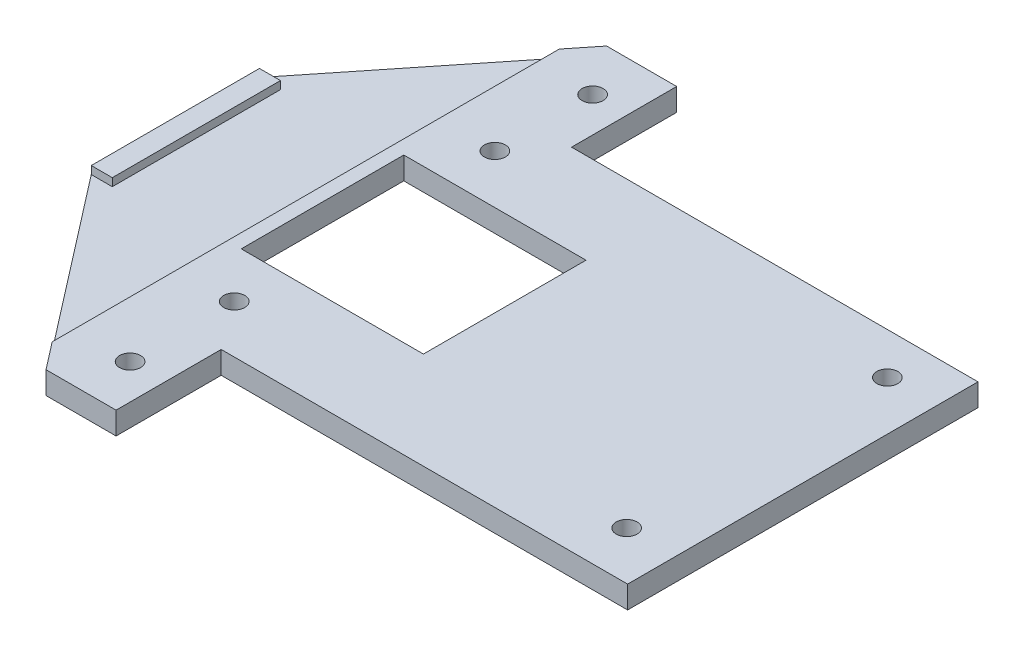
ISO-10303-21;
HEADER;
FILE_DESCRIPTION(('STEP AP214'),'2;1');
FILE_NAME('part.step','',(''),(''),'','','');
FILE_SCHEMA(('AUTOMOTIVE_DESIGN { 1 0 10303 214 1 1 1 1 }'));
ENDSEC;
DATA;
#1=APPLICATION_CONTEXT('core data for automotive mechanical design processes');
#2=APPLICATION_PROTOCOL_DEFINITION('international standard','automotive_design',2000,#1);
#3=PRODUCT_CONTEXT('',#1,'mechanical');
#4=PRODUCT('Part','Part','',(#3));
#5=PRODUCT_RELATED_PRODUCT_CATEGORY('part','',(#4));
#6=PRODUCT_DEFINITION_FORMATION('','',#4);
#7=PRODUCT_DEFINITION_CONTEXT('part definition',#1,'design');
#8=PRODUCT_DEFINITION('design','',#6,#7);
#9=PRODUCT_DEFINITION_SHAPE('','',#8);
#10=(LENGTH_UNIT() NAMED_UNIT(*) SI_UNIT(.MILLI.,.METRE.));
#11=(NAMED_UNIT(*) PLANE_ANGLE_UNIT() SI_UNIT($,.RADIAN.));
#12=(NAMED_UNIT(*) SI_UNIT($,.STERADIAN.) SOLID_ANGLE_UNIT());
#13=UNCERTAINTY_MEASURE_WITH_UNIT(LENGTH_MEASURE(1.E-05),#10,'distance_accuracy_value','');
#14=(GEOMETRIC_REPRESENTATION_CONTEXT(3) GLOBAL_UNCERTAINTY_ASSIGNED_CONTEXT((#13)) GLOBAL_UNIT_ASSIGNED_CONTEXT((#10,
#11,#12)) REPRESENTATION_CONTEXT('',''));
#15=CARTESIAN_POINT('',(0.,0.,0.));
#16=DIRECTION('',(0.,0.,1.));
#17=DIRECTION('',(1.,0.,0.));
#18=AXIS2_PLACEMENT_3D('',#15,#16,#17);
#19=CARTESIAN_POINT('',(0.,1.6,0.));
#20=DIRECTION('',(0.,1.,0.));
#21=DIRECTION('',(0.,0.,1.));
#22=AXIS2_PLACEMENT_3D('',#19,#20,#21);
#23=PLANE('',#22);
#24=CARTESIAN_POINT('',(13.5,1.6,-9.3));
#25=DIRECTION('',(0.,1.,0.));
#26=DIRECTION('',(0.,0.,1.));
#27=AXIS2_PLACEMENT_3D('',#24,#25,#26);
#28=CIRCLE('',#27,0.75);
#29=CARTESIAN_POINT('',(13.5,1.6,-8.55));
#30=VERTEX_POINT('',#29);
#31=EDGE_CURVE('E316',#30,#30,#28,.T.);
#32=ORIENTED_EDGE('',*,*,#31,.F.);
#33=EDGE_LOOP('',(#32));
#34=FACE_BOUND('',#33,.T.);
#35=CARTESIAN_POINT('',(41.5,1.6,-9.3));
#36=DIRECTION('',(0.,1.,0.));
#37=DIRECTION('',(0.,0.,1.));
#38=AXIS2_PLACEMENT_3D('',#35,#36,#37);
#39=CIRCLE('',#38,0.749999999999999);
#40=CARTESIAN_POINT('',(41.5,1.6,-8.55));
#41=VERTEX_POINT('',#40);
#42=EDGE_CURVE('E342',#41,#41,#39,.T.);
#43=ORIENTED_EDGE('',*,*,#42,.F.);
#44=EDGE_LOOP('',(#43));
#45=FACE_BOUND('',#44,.T.);
#46=CARTESIAN_POINT('',(41.5,1.6,9.3));
#47=DIRECTION('',(0.,1.,0.));
#48=DIRECTION('',(0.,0.,1.));
#49=AXIS2_PLACEMENT_3D('',#46,#47,#48);
#50=CIRCLE('',#49,0.749999999999999);
#51=CARTESIAN_POINT('',(41.5,1.6,10.05));
#52=VERTEX_POINT('',#51);
#53=EDGE_CURVE('E339',#52,#52,#50,.T.);
#54=ORIENTED_EDGE('',*,*,#53,.F.);
#55=EDGE_LOOP('',(#54));
#56=FACE_BOUND('',#55,.T.);
#57=CARTESIAN_POINT('',(13.5,1.6,9.3));
#58=DIRECTION('',(0.,1.,0.));
#59=DIRECTION('',(0.,0.,1.));
#60=AXIS2_PLACEMENT_3D('',#57,#58,#59);
#61=CIRCLE('',#60,0.75);
#62=CARTESIAN_POINT('',(13.5,1.6,10.05));
#63=VERTEX_POINT('',#62);
#64=EDGE_CURVE('E336',#63,#63,#61,.T.);
#65=ORIENTED_EDGE('',*,*,#64,.F.);
#66=EDGE_LOOP('',(#65));
#67=FACE_BOUND('',#66,.T.);
#68=CARTESIAN_POINT('',(13.5,1.6,16.73));
#69=DIRECTION('',(0.,1.,0.));
#70=DIRECTION('',(0.,0.,1.));
#71=AXIS2_PLACEMENT_3D('',#68,#69,#70);
#72=CIRCLE('',#71,0.75);
#73=CARTESIAN_POINT('',(13.5,1.6,17.48));
#74=VERTEX_POINT('',#73);
#75=EDGE_CURVE('E333',#74,#74,#72,.T.);
#76=ORIENTED_EDGE('',*,*,#75,.F.);
#77=EDGE_LOOP('',(#76));
#78=FACE_BOUND('',#77,.T.);
#79=CARTESIAN_POINT('',(13.5,1.6,-16.27));
#80=DIRECTION('',(0.,1.,0.));
#81=DIRECTION('',(0.,0.,1.));
#82=AXIS2_PLACEMENT_3D('',#79,#80,#81);
#83=CIRCLE('',#82,0.75);
#84=CARTESIAN_POINT('',(13.5,1.6,-15.52));
#85=VERTEX_POINT('',#84);
#86=EDGE_CURVE('E311',#85,#85,#83,.T.);
#87=ORIENTED_EDGE('',*,*,#86,.F.);
#88=EDGE_LOOP('',(#87));
#89=FACE_BOUND('',#88,.T.);
#90=DIRECTION('',(0.,0.,1.));
#91=VECTOR('',#90,1.);
#92=CARTESIAN_POINT('',(10.5,1.6,-5.8));
#93=LINE('',#92,#91);
#94=CARTESIAN_POINT('',(10.5,1.6,-5.8));
#95=VERTEX_POINT('',#94);
#96=CARTESIAN_POINT('',(10.5,1.6,5.8));
#97=VERTEX_POINT('',#96);
#98=EDGE_CURVE('E49',#95,#97,#93,.T.);
#99=ORIENTED_EDGE('',*,*,#98,.F.);
#100=DIRECTION('',(-1.,0.,0.));
#101=VECTOR('',#100,1.);
#102=CARTESIAN_POINT('',(10.5,1.6,-5.8));
#103=LINE('',#102,#101);
#104=CARTESIAN_POINT('',(23.5,1.6,-5.8));
#105=VERTEX_POINT('',#104);
#106=EDGE_CURVE('E183',#105,#95,#103,.T.);
#107=ORIENTED_EDGE('',*,*,#106,.F.);
#108=DIRECTION('',(0.,0.,-1.));
#109=VECTOR('',#108,1.);
#110=CARTESIAN_POINT('',(23.5,1.6,-5.8));
#111=LINE('',#110,#109);
#112=CARTESIAN_POINT('',(23.5,1.6,5.8));
#113=VERTEX_POINT('',#112);
#114=EDGE_CURVE('E168',#113,#105,#111,.T.);
#115=ORIENTED_EDGE('',*,*,#114,.F.);
#116=DIRECTION('',(1.,0.,0.));
#117=VECTOR('',#116,1.);
#118=CARTESIAN_POINT('',(10.5,1.6,5.8));
#119=LINE('',#118,#117);
#120=EDGE_CURVE('E177',#97,#113,#119,.T.);
#121=ORIENTED_EDGE('',*,*,#120,.F.);
#122=EDGE_LOOP('',(#99,#107,#115,#121));
#123=FACE_BOUND('',#122,.T.);
#124=DIRECTION('',(0.,0.,-1.));
#125=VECTOR('',#124,1.);
#126=CARTESIAN_POINT('',(9.5,1.6,18.2895454545455));
#127=LINE('',#126,#125);
#128=CARTESIAN_POINT('',(9.5,1.6,18.2895454545455));
#129=VERTEX_POINT('',#128);
#130=CARTESIAN_POINT('',(9.5,1.6,-17.8922727272727));
#131=VERTEX_POINT('',#130);
#132=EDGE_CURVE('E197',#129,#131,#127,.T.);
#133=ORIENTED_EDGE('',*,*,#132,.F.);
#134=DIRECTION('',(0.611589905380932,0.,0.791174941233696));
#135=VECTOR('',#134,1.);
#136=CARTESIAN_POINT('',(0.,1.6,6.));
#137=LINE('',#136,#135);
#138=CARTESIAN_POINT('',(11.,1.6,20.23));
#139=VERTEX_POINT('',#138);
#140=EDGE_CURVE('E236',#129,#139,#137,.T.);
#141=ORIENTED_EDGE('',*,*,#140,.T.);
#142=DIRECTION('',(1.,0.,0.));
#143=VECTOR('',#142,1.);
#144=CARTESIAN_POINT('',(11.,1.6,20.23));
#145=LINE('',#144,#143);
#146=CARTESIAN_POINT('',(16.,1.6,20.23));
#147=VERTEX_POINT('',#146);
#148=EDGE_CURVE('E238',#139,#147,#145,.T.);
#149=ORIENTED_EDGE('',*,*,#148,.T.);
#150=DIRECTION('',(0.,0.,-1.));
#151=VECTOR('',#150,1.);
#152=CARTESIAN_POINT('',(16.,1.6,20.23));
#153=LINE('',#152,#151);
#154=CARTESIAN_POINT('',(16.,1.6,12.73));
#155=VERTEX_POINT('',#154);
#156=EDGE_CURVE('E240',#147,#155,#153,.T.);
#157=ORIENTED_EDGE('',*,*,#156,.T.);
#158=DIRECTION('',(1.,0.,0.));
#159=VECTOR('',#158,1.);
#160=CARTESIAN_POINT('',(16.,1.6,12.73));
#161=LINE('',#160,#159);
#162=CARTESIAN_POINT('',(45.,1.6,12.73));
#163=VERTEX_POINT('',#162);
#164=EDGE_CURVE('E242',#155,#163,#161,.T.);
#165=ORIENTED_EDGE('',*,*,#164,.T.);
#166=DIRECTION('',(0.,0.,-1.));
#167=VECTOR('',#166,1.);
#168=CARTESIAN_POINT('',(45.,1.6,12.73));
#169=LINE('',#168,#167);
#170=CARTESIAN_POINT('',(45.,1.6,-12.27));
#171=VERTEX_POINT('',#170);
#172=EDGE_CURVE('E244',#163,#171,#169,.T.);
#173=ORIENTED_EDGE('',*,*,#172,.T.);
#174=DIRECTION('',(-1.,0.,0.));
#175=VECTOR('',#174,1.);
#176=CARTESIAN_POINT('',(45.,1.6,-12.27));
#177=LINE('',#176,#175);
#178=CARTESIAN_POINT('',(16.,1.6,-12.27));
#179=VERTEX_POINT('',#178);
#180=EDGE_CURVE('E246',#171,#179,#177,.T.);
#181=ORIENTED_EDGE('',*,*,#180,.T.);
#182=DIRECTION('',(0.,0.,-1.));
#183=VECTOR('',#182,1.);
#184=CARTESIAN_POINT('',(16.,1.6,-12.27));
#185=LINE('',#184,#183);
#186=CARTESIAN_POINT('',(16.,1.6,-19.77));
#187=VERTEX_POINT('',#186);
#188=EDGE_CURVE('E248',#179,#187,#185,.T.);
#189=ORIENTED_EDGE('',*,*,#188,.T.);
#190=DIRECTION('',(-1.,0.,0.));
#191=VECTOR('',#190,1.);
#192=CARTESIAN_POINT('',(16.,1.6,-19.77));
#193=LINE('',#192,#191);
#194=CARTESIAN_POINT('',(11.,1.6,-19.77));
#195=VERTEX_POINT('',#194);
#196=EDGE_CURVE('E250',#187,#195,#193,.T.);
#197=ORIENTED_EDGE('',*,*,#196,.T.);
#198=DIRECTION('',(-0.624141328431295,0.,0.781311462954448));
#199=VECTOR('',#198,1.);
#200=CARTESIAN_POINT('',(11.,1.6,-19.77));
#201=LINE('',#200,#199);
#202=EDGE_CURVE('E229',#195,#131,#201,.T.);
#203=ORIENTED_EDGE('',*,*,#202,.T.);
#204=EDGE_LOOP('',(#133,#141,#149,#157,#165,#173,#181,#189,#197,#203));
#205=FACE_BOUND('',#204,.T.);
#206=ADVANCED_FACE('F32',(#34,#45,#56,#67,#78,#89,#123,#205),#23,.T.);
#207=CARTESIAN_POINT('',(11.,1.6,-19.77));
#208=DIRECTION('',(0.781311462954448,0.,0.624141328431295));
#209=DIRECTION('',(0.624141328431295,0.,-0.781311462954448));
#210=AXIS2_PLACEMENT_3D('',#207,#208,#209);
#211=PLANE('',#210);
#212=DIRECTION('',(-0.624141328431294,0.,0.781311462954448));
#213=VECTOR('',#212,1.);
#214=CARTESIAN_POINT('',(9.5,1.04,-17.8922727272727));
#215=LINE('',#214,#213);
#216=CARTESIAN_POINT('',(9.5,1.04,-17.8922727272727));
#217=VERTEX_POINT('',#216);
#218=CARTESIAN_POINT('',(0.,1.04,-6.));
#219=VERTEX_POINT('',#218);
#220=EDGE_CURVE('E193',#217,#219,#215,.T.);
#221=ORIENTED_EDGE('',*,*,#220,.F.);
#222=DIRECTION('',(0.,1.,0.));
#223=VECTOR('',#222,1.);
#224=CARTESIAN_POINT('',(9.5,1.04,-17.8922727272727));
#225=LINE('',#224,#223);
#226=EDGE_CURVE('E220',#217,#131,#225,.T.);
#227=ORIENTED_EDGE('',*,*,#226,.T.);
#228=ORIENTED_EDGE('',*,*,#202,.F.);
#229=DIRECTION('',(0.,-1.,0.));
#230=VECTOR('',#229,1.);
#231=CARTESIAN_POINT('',(11.,1.6,-19.77));
#232=LINE('',#231,#230);
#233=CARTESIAN_POINT('',(11.,0.,-19.77));
#234=VERTEX_POINT('',#233);
#235=EDGE_CURVE('E252',#195,#234,#232,.T.);
#236=ORIENTED_EDGE('',*,*,#235,.T.);
#237=DIRECTION('',(-0.624141328431295,0.,0.781311462954448));
#238=VECTOR('',#237,1.);
#239=CARTESIAN_POINT('',(11.,0.,-19.77));
#240=LINE('',#239,#238);
#241=CARTESIAN_POINT('',(0.,0.,-6.));
#242=VERTEX_POINT('',#241);
#243=EDGE_CURVE('E223',#234,#242,#240,.T.);
#244=ORIENTED_EDGE('',*,*,#243,.T.);
#245=DIRECTION('',(0.,-1.,0.));
#246=VECTOR('',#245,1.);
#247=CARTESIAN_POINT('',(0.,1.6,-6.));
#248=LINE('',#247,#246);
#249=EDGE_CURVE('E299',#219,#242,#248,.T.);
#250=ORIENTED_EDGE('',*,*,#249,.F.);
#251=EDGE_LOOP('',(#221,#227,#228,#236,#244,#250));
#252=FACE_BOUND('',#251,.T.);
#253=ADVANCED_FACE('F34',(#252),#211,.F.);
#254=CARTESIAN_POINT('',(0.,1.6,-6.));
#255=DIRECTION('',(1.,0.,0.));
#256=DIRECTION('',(0.,0.,-1.));
#257=AXIS2_PLACEMENT_3D('',#254,#255,#256);
#258=PLANE('',#257);
#259=DIRECTION('',(0.,0.,1.));
#260=VECTOR('',#259,1.);
#261=CARTESIAN_POINT('',(0.,0.,-6.));
#262=LINE('',#261,#260);
#263=CARTESIAN_POINT('',(0.,0.,6.));
#264=VERTEX_POINT('',#263);
#265=EDGE_CURVE('E255',#242,#264,#262,.T.);
#266=ORIENTED_EDGE('',*,*,#265,.T.);
#267=DIRECTION('',(0.,-1.,0.));
#268=VECTOR('',#267,1.);
#269=CARTESIAN_POINT('',(0.,1.6,6.));
#270=LINE('',#269,#268);
#271=CARTESIAN_POINT('',(0.,1.04,6.));
#272=VERTEX_POINT('',#271);
#273=EDGE_CURVE('E296',#272,#264,#270,.T.);
#274=ORIENTED_EDGE('',*,*,#273,.F.);
#275=CARTESIAN_POINT('',(0.,1.6,6.));
#276=VERTEX_POINT('',#275);
#277=EDGE_CURVE('E297',#276,#272,#270,.T.);
#278=ORIENTED_EDGE('',*,*,#277,.F.);
#279=DIRECTION('',(0.,0.,1.));
#280=VECTOR('',#279,1.);
#281=CARTESIAN_POINT('',(0.,1.6,-6.));
#282=LINE('',#281,#280);
#283=CARTESIAN_POINT('',(0.,1.6,-6.));
#284=VERTEX_POINT('',#283);
#285=EDGE_CURVE('E232',#284,#276,#282,.T.);
#286=ORIENTED_EDGE('',*,*,#285,.F.);
#287=EDGE_CURVE('E300',#284,#219,#248,.T.);
#288=ORIENTED_EDGE('',*,*,#287,.T.);
#289=ORIENTED_EDGE('',*,*,#249,.T.);
#290=EDGE_LOOP('',(#266,#274,#278,#286,#288,#289));
#291=FACE_BOUND('',#290,.T.);
#292=ADVANCED_FACE('F431',(#291),#258,.F.);
#293=CARTESIAN_POINT('',(0.,1.6,6.));
#294=DIRECTION('',(0.791174941233696,0.,-0.611589905380932));
#295=DIRECTION('',(-0.611589905380932,0.,-0.791174941233696));
#296=AXIS2_PLACEMENT_3D('',#293,#294,#295);
#297=PLANE('',#296);
#298=ORIENTED_EDGE('',*,*,#140,.F.);
#299=DIRECTION('',(0.,1.,0.));
#300=VECTOR('',#299,1.);
#301=CARTESIAN_POINT('',(9.5,1.04,18.2895454545455));
#302=LINE('',#301,#300);
#303=CARTESIAN_POINT('',(9.5,1.04,18.2895454545455));
#304=VERTEX_POINT('',#303);
#305=EDGE_CURVE('E224',#304,#129,#302,.T.);
#306=ORIENTED_EDGE('',*,*,#305,.F.);
#307=DIRECTION('',(0.611589905380932,0.,0.791174941233696));
#308=VECTOR('',#307,1.);
#309=CARTESIAN_POINT('',(0.,1.04,6.));
#310=LINE('',#309,#308);
#311=EDGE_CURVE('E206',#272,#304,#310,.T.);
#312=ORIENTED_EDGE('',*,*,#311,.F.);
#313=ORIENTED_EDGE('',*,*,#273,.T.);
#314=DIRECTION('',(0.611589905380932,0.,0.791174941233696));
#315=VECTOR('',#314,1.);
#316=CARTESIAN_POINT('',(0.,0.,6.));
#317=LINE('',#316,#315);
#318=CARTESIAN_POINT('',(11.,0.,20.23));
#319=VERTEX_POINT('',#318);
#320=EDGE_CURVE('E258',#264,#319,#317,.T.);
#321=ORIENTED_EDGE('',*,*,#320,.T.);
#322=DIRECTION('',(0.,-1.,0.));
#323=VECTOR('',#322,1.);
#324=CARTESIAN_POINT('',(11.,1.6,20.23));
#325=LINE('',#324,#323);
#326=EDGE_CURVE('E293',#139,#319,#325,.T.);
#327=ORIENTED_EDGE('',*,*,#326,.F.);
#328=EDGE_LOOP('',(#298,#306,#312,#313,#321,#327));
#329=FACE_BOUND('',#328,.T.);
#330=ADVANCED_FACE('F425',(#329),#297,.F.);
#331=CARTESIAN_POINT('',(11.,1.6,20.23));
#332=DIRECTION('',(0.,0.,-1.));
#333=DIRECTION('',(-1.,0.,0.));
#334=AXIS2_PLACEMENT_3D('',#331,#332,#333);
#335=PLANE('',#334);
#336=DIRECTION('',(1.,0.,0.));
#337=VECTOR('',#336,1.);
#338=CARTESIAN_POINT('',(11.,0.,20.23));
#339=LINE('',#338,#337);
#340=CARTESIAN_POINT('',(16.,0.,20.23));
#341=VERTEX_POINT('',#340);
#342=EDGE_CURVE('E260',#319,#341,#339,.T.);
#343=ORIENTED_EDGE('',*,*,#342,.T.);
#344=DIRECTION('',(0.,-1.,0.));
#345=VECTOR('',#344,1.);
#346=CARTESIAN_POINT('',(16.,1.6,20.23));
#347=LINE('',#346,#345);
#348=EDGE_CURVE('E290',#147,#341,#347,.T.);
#349=ORIENTED_EDGE('',*,*,#348,.F.);
#350=ORIENTED_EDGE('',*,*,#148,.F.);
#351=ORIENTED_EDGE('',*,*,#326,.T.);
#352=EDGE_LOOP('',(#343,#349,#350,#351));
#353=FACE_BOUND('',#352,.T.);
#354=ADVANCED_FACE('F421',(#353),#335,.F.);
#355=CARTESIAN_POINT('',(16.,1.6,20.23));
#356=DIRECTION('',(-1.,0.,0.));
#357=DIRECTION('',(0.,0.,1.));
#358=AXIS2_PLACEMENT_3D('',#355,#356,#357);
#359=PLANE('',#358);
#360=DIRECTION('',(0.,0.,-1.));
#361=VECTOR('',#360,1.);
#362=CARTESIAN_POINT('',(16.,0.,20.23));
#363=LINE('',#362,#361);
#364=CARTESIAN_POINT('',(16.,0.,12.73));
#365=VERTEX_POINT('',#364);
#366=EDGE_CURVE('E262',#341,#365,#363,.T.);
#367=ORIENTED_EDGE('',*,*,#366,.T.);
#368=DIRECTION('',(0.,-1.,0.));
#369=VECTOR('',#368,1.);
#370=CARTESIAN_POINT('',(16.,1.6,12.73));
#371=LINE('',#370,#369);
#372=EDGE_CURVE('E287',#155,#365,#371,.T.);
#373=ORIENTED_EDGE('',*,*,#372,.F.);
#374=ORIENTED_EDGE('',*,*,#156,.F.);
#375=ORIENTED_EDGE('',*,*,#348,.T.);
#376=EDGE_LOOP('',(#367,#373,#374,#375));
#377=FACE_BOUND('',#376,.T.);
#378=ADVANCED_FACE('F416',(#377),#359,.F.);
#379=CARTESIAN_POINT('',(16.,1.6,12.73));
#380=DIRECTION('',(0.,0.,-1.));
#381=DIRECTION('',(-1.,0.,0.));
#382=AXIS2_PLACEMENT_3D('',#379,#380,#381);
#383=PLANE('',#382);
#384=DIRECTION('',(1.,0.,0.));
#385=VECTOR('',#384,1.);
#386=CARTESIAN_POINT('',(16.,0.,12.73));
#387=LINE('',#386,#385);
#388=CARTESIAN_POINT('',(45.,0.,12.73));
#389=VERTEX_POINT('',#388);
#390=EDGE_CURVE('E264',#365,#389,#387,.T.);
#391=ORIENTED_EDGE('',*,*,#390,.T.);
#392=DIRECTION('',(0.,-1.,0.));
#393=VECTOR('',#392,1.);
#394=CARTESIAN_POINT('',(45.,1.6,12.73));
#395=LINE('',#394,#393);
#396=EDGE_CURVE('E284',#163,#389,#395,.T.);
#397=ORIENTED_EDGE('',*,*,#396,.F.);
#398=ORIENTED_EDGE('',*,*,#164,.F.);
#399=ORIENTED_EDGE('',*,*,#372,.T.);
#400=EDGE_LOOP('',(#391,#397,#398,#399));
#401=FACE_BOUND('',#400,.T.);
#402=ADVANCED_FACE('F411',(#401),#383,.F.);
#403=CARTESIAN_POINT('',(45.,1.6,12.73));
#404=DIRECTION('',(-1.,0.,0.));
#405=DIRECTION('',(0.,0.,1.));
#406=AXIS2_PLACEMENT_3D('',#403,#404,#405);
#407=PLANE('',#406);
#408=DIRECTION('',(0.,0.,-1.));
#409=VECTOR('',#408,1.);
#410=CARTESIAN_POINT('',(45.,0.,12.73));
#411=LINE('',#410,#409);
#412=CARTESIAN_POINT('',(45.,0.,-12.27));
#413=VERTEX_POINT('',#412);
#414=EDGE_CURVE('E266',#389,#413,#411,.T.);
#415=ORIENTED_EDGE('',*,*,#414,.T.);
#416=DIRECTION('',(0.,-1.,0.));
#417=VECTOR('',#416,1.);
#418=CARTESIAN_POINT('',(45.,1.6,-12.27));
#419=LINE('',#418,#417);
#420=EDGE_CURVE('E281',#171,#413,#419,.T.);
#421=ORIENTED_EDGE('',*,*,#420,.F.);
#422=ORIENTED_EDGE('',*,*,#172,.F.);
#423=ORIENTED_EDGE('',*,*,#396,.T.);
#424=EDGE_LOOP('',(#415,#421,#422,#423));
#425=FACE_BOUND('',#424,.T.);
#426=ADVANCED_FACE('F407',(#425),#407,.F.);
#427=CARTESIAN_POINT('',(45.,1.6,-12.27));
#428=DIRECTION('',(0.,0.,1.));
#429=DIRECTION('',(1.,0.,0.));
#430=AXIS2_PLACEMENT_3D('',#427,#428,#429);
#431=PLANE('',#430);
#432=DIRECTION('',(-1.,0.,0.));
#433=VECTOR('',#432,1.);
#434=CARTESIAN_POINT('',(45.,0.,-12.27));
#435=LINE('',#434,#433);
#436=CARTESIAN_POINT('',(16.,0.,-12.27));
#437=VERTEX_POINT('',#436);
#438=EDGE_CURVE('E268',#413,#437,#435,.T.);
#439=ORIENTED_EDGE('',*,*,#438,.T.);
#440=DIRECTION('',(0.,-1.,0.));
#441=VECTOR('',#440,1.);
#442=CARTESIAN_POINT('',(16.,1.6,-12.27));
#443=LINE('',#442,#441);
#444=EDGE_CURVE('E278',#179,#437,#443,.T.);
#445=ORIENTED_EDGE('',*,*,#444,.F.);
#446=ORIENTED_EDGE('',*,*,#180,.F.);
#447=ORIENTED_EDGE('',*,*,#420,.T.);
#448=EDGE_LOOP('',(#439,#445,#446,#447));
#449=FACE_BOUND('',#448,.T.);
#450=ADVANCED_FACE('F402',(#449),#431,.F.);
#451=CARTESIAN_POINT('',(16.,1.6,-12.27));
#452=DIRECTION('',(-1.,0.,0.));
#453=DIRECTION('',(0.,0.,1.));
#454=AXIS2_PLACEMENT_3D('',#451,#452,#453);
#455=PLANE('',#454);
#456=DIRECTION('',(0.,0.,-1.));
#457=VECTOR('',#456,1.);
#458=CARTESIAN_POINT('',(16.,0.,-12.27));
#459=LINE('',#458,#457);
#460=CARTESIAN_POINT('',(16.,0.,-19.77));
#461=VERTEX_POINT('',#460);
#462=EDGE_CURVE('E270',#437,#461,#459,.T.);
#463=ORIENTED_EDGE('',*,*,#462,.T.);
#464=DIRECTION('',(0.,-1.,0.));
#465=VECTOR('',#464,1.);
#466=CARTESIAN_POINT('',(16.,1.6,-19.77));
#467=LINE('',#466,#465);
#468=EDGE_CURVE('E275',#187,#461,#467,.T.);
#469=ORIENTED_EDGE('',*,*,#468,.F.);
#470=ORIENTED_EDGE('',*,*,#188,.F.);
#471=ORIENTED_EDGE('',*,*,#444,.T.);
#472=EDGE_LOOP('',(#463,#469,#470,#471));
#473=FACE_BOUND('',#472,.T.);
#474=ADVANCED_FACE('F396',(#473),#455,.F.);
#475=CARTESIAN_POINT('',(16.,1.6,-19.77));
#476=DIRECTION('',(0.,0.,1.));
#477=DIRECTION('',(1.,0.,0.));
#478=AXIS2_PLACEMENT_3D('',#475,#476,#477);
#479=PLANE('',#478);
#480=DIRECTION('',(-1.,0.,0.));
#481=VECTOR('',#480,1.);
#482=CARTESIAN_POINT('',(16.,0.,-19.77));
#483=LINE('',#482,#481);
#484=EDGE_CURVE('E233',#461,#234,#483,.T.);
#485=ORIENTED_EDGE('',*,*,#484,.T.);
#486=ORIENTED_EDGE('',*,*,#235,.F.);
#487=ORIENTED_EDGE('',*,*,#196,.F.);
#488=ORIENTED_EDGE('',*,*,#468,.T.);
#489=EDGE_LOOP('',(#485,#486,#487,#488));
#490=FACE_BOUND('',#489,.T.);
#491=ADVANCED_FACE('F392',(#490),#479,.F.);
#492=DIRECTION('',(-1.,0.,0.));
#493=VECTOR('',#492,1.);
#494=CARTESIAN_POINT('',(0.,1.6,6.));
#495=LINE('',#494,#493);
#496=CARTESIAN_POINT('',(1.5,1.6,6.));
#497=VERTEX_POINT('',#496);
#498=EDGE_CURVE('E217',#497,#276,#495,.T.);
#499=ORIENTED_EDGE('',*,*,#498,.F.);
#500=DIRECTION('',(0.,0.,1.));
#501=VECTOR('',#500,1.);
#502=CARTESIAN_POINT('',(1.5,1.6,-6.));
#503=LINE('',#502,#501);
#504=CARTESIAN_POINT('',(1.5,1.6,-6.));
#505=VERTEX_POINT('',#504);
#506=EDGE_CURVE('E214',#505,#497,#503,.T.);
#507=ORIENTED_EDGE('',*,*,#506,.F.);
#508=DIRECTION('',(1.,0.,0.));
#509=VECTOR('',#508,1.);
#510=CARTESIAN_POINT('',(0.,1.6,-6.));
#511=LINE('',#510,#509);
#512=EDGE_CURVE('E190',#284,#505,#511,.T.);
#513=ORIENTED_EDGE('',*,*,#512,.F.);
#514=ORIENTED_EDGE('',*,*,#285,.T.);
#515=EDGE_LOOP('',(#499,#507,#513,#514));
#516=FACE_BOUND('',#515,.T.);
#517=ADVANCED_FACE('F354',(#516),#23,.T.);
#518=CARTESIAN_POINT('',(0.,0.,0.));
#519=DIRECTION('',(0.,1.,0.));
#520=DIRECTION('',(0.,0.,1.));
#521=AXIS2_PLACEMENT_3D('',#518,#519,#520);
#522=PLANE('',#521);
#523=CARTESIAN_POINT('',(13.5,0.,-9.3));
#524=DIRECTION('',(0.,1.,0.));
#525=DIRECTION('',(0.,0.,1.));
#526=AXIS2_PLACEMENT_3D('',#523,#524,#525);
#527=CIRCLE('',#526,0.75);
#528=CARTESIAN_POINT('',(13.5,0.,-8.55));
#529=VERTEX_POINT('',#528);
#530=EDGE_CURVE('E36',#529,#529,#527,.T.);
#531=ORIENTED_EDGE('',*,*,#530,.T.);
#532=EDGE_LOOP('',(#531));
#533=FACE_BOUND('',#532,.T.);
#534=CARTESIAN_POINT('',(41.5,0.,-9.3));
#535=DIRECTION('',(0.,1.,0.));
#536=DIRECTION('',(0.,0.,1.));
#537=AXIS2_PLACEMENT_3D('',#534,#535,#536);
#538=CIRCLE('',#537,0.749999999999999);
#539=CARTESIAN_POINT('',(41.5,0.,-8.55));
#540=VERTEX_POINT('',#539);
#541=EDGE_CURVE('E321',#540,#540,#538,.T.);
#542=ORIENTED_EDGE('',*,*,#541,.T.);
#543=EDGE_LOOP('',(#542));
#544=FACE_BOUND('',#543,.T.);
#545=CARTESIAN_POINT('',(41.5,0.,9.3));
#546=DIRECTION('',(0.,1.,0.));
#547=DIRECTION('',(0.,0.,1.));
#548=AXIS2_PLACEMENT_3D('',#545,#546,#547);
#549=CIRCLE('',#548,0.749999999999999);
#550=CARTESIAN_POINT('',(41.5,0.,10.05));
#551=VERTEX_POINT('',#550);
#552=EDGE_CURVE('E319',#551,#551,#549,.T.);
#553=ORIENTED_EDGE('',*,*,#552,.T.);
#554=EDGE_LOOP('',(#553));
#555=FACE_BOUND('',#554,.T.);
#556=CARTESIAN_POINT('',(13.5,0.,9.3));
#557=DIRECTION('',(0.,1.,0.));
#558=DIRECTION('',(0.,0.,1.));
#559=AXIS2_PLACEMENT_3D('',#556,#557,#558);
#560=CIRCLE('',#559,0.75);
#561=CARTESIAN_POINT('',(13.5,0.,10.05));
#562=VERTEX_POINT('',#561);
#563=EDGE_CURVE('E315',#562,#562,#560,.T.);
#564=ORIENTED_EDGE('',*,*,#563,.T.);
#565=EDGE_LOOP('',(#564));
#566=FACE_BOUND('',#565,.T.);
#567=CARTESIAN_POINT('',(13.5,0.,16.73));
#568=DIRECTION('',(0.,1.,0.));
#569=DIRECTION('',(0.,0.,1.));
#570=AXIS2_PLACEMENT_3D('',#567,#568,#569);
#571=CIRCLE('',#570,0.75);
#572=CARTESIAN_POINT('',(13.5,0.,17.48));
#573=VERTEX_POINT('',#572);
#574=EDGE_CURVE('E312',#573,#573,#571,.T.);
#575=ORIENTED_EDGE('',*,*,#574,.T.);
#576=EDGE_LOOP('',(#575));
#577=FACE_BOUND('',#576,.T.);
#578=CARTESIAN_POINT('',(13.5,0.,-16.27));
#579=DIRECTION('',(0.,1.,0.));
#580=DIRECTION('',(0.,0.,1.));
#581=AXIS2_PLACEMENT_3D('',#578,#579,#580);
#582=CIRCLE('',#581,0.75);
#583=CARTESIAN_POINT('',(13.5,0.,-15.52));
#584=VERTEX_POINT('',#583);
#585=EDGE_CURVE('E308',#584,#584,#582,.T.);
#586=ORIENTED_EDGE('',*,*,#585,.T.);
#587=EDGE_LOOP('',(#586));
#588=FACE_BOUND('',#587,.T.);
#589=DIRECTION('',(-1.,0.,0.));
#590=VECTOR('',#589,1.);
#591=CARTESIAN_POINT('',(0.,0.,-5.8));
#592=LINE('',#591,#590);
#593=CARTESIAN_POINT('',(23.5,0.,-5.8));
#594=VERTEX_POINT('',#593);
#595=CARTESIAN_POINT('',(10.5,0.,-5.8));
#596=VERTEX_POINT('',#595);
#597=EDGE_CURVE('E41',#594,#596,#592,.T.);
#598=ORIENTED_EDGE('',*,*,#597,.T.);
#599=DIRECTION('',(0.,0.,1.));
#600=VECTOR('',#599,1.);
#601=CARTESIAN_POINT('',(10.5,0.,0.));
#602=LINE('',#601,#600);
#603=CARTESIAN_POINT('',(10.5,0.,5.8));
#604=VERTEX_POINT('',#603);
#605=EDGE_CURVE('E11',#596,#604,#602,.T.);
#606=ORIENTED_EDGE('',*,*,#605,.T.);
#607=DIRECTION('',(1.,0.,0.));
#608=VECTOR('',#607,1.);
#609=CARTESIAN_POINT('',(0.,0.,5.8));
#610=LINE('',#609,#608);
#611=CARTESIAN_POINT('',(23.5,0.,5.8));
#612=VERTEX_POINT('',#611);
#613=EDGE_CURVE('E303',#604,#612,#610,.T.);
#614=ORIENTED_EDGE('',*,*,#613,.T.);
#615=DIRECTION('',(0.,0.,-1.));
#616=VECTOR('',#615,1.);
#617=CARTESIAN_POINT('',(23.5,0.,0.));
#618=LINE('',#617,#616);
#619=EDGE_CURVE('E171',#612,#594,#618,.T.);
#620=ORIENTED_EDGE('',*,*,#619,.T.);
#621=EDGE_LOOP('',(#598,#606,#614,#620));
#622=FACE_BOUND('',#621,.T.);
#623=ORIENTED_EDGE('',*,*,#243,.F.);
#624=ORIENTED_EDGE('',*,*,#484,.F.);
#625=ORIENTED_EDGE('',*,*,#462,.F.);
#626=ORIENTED_EDGE('',*,*,#438,.F.);
#627=ORIENTED_EDGE('',*,*,#414,.F.);
#628=ORIENTED_EDGE('',*,*,#390,.F.);
#629=ORIENTED_EDGE('',*,*,#366,.F.);
#630=ORIENTED_EDGE('',*,*,#342,.F.);
#631=ORIENTED_EDGE('',*,*,#320,.F.);
#632=ORIENTED_EDGE('',*,*,#265,.F.);
#633=EDGE_LOOP('',(#623,#624,#625,#626,#627,#628,#629,#630,#631,#632));
#634=FACE_BOUND('',#633,.T.);
#635=ADVANCED_FACE('F372',(#533,#544,#555,#566,#577,#588,#622,#634),#522,.F.);
#636=CARTESIAN_POINT('',(9.5,1.04,18.2895454545455));
#637=DIRECTION('',(1.,0.,0.));
#638=DIRECTION('',(0.,0.,-1.));
#639=AXIS2_PLACEMENT_3D('',#636,#637,#638);
#640=PLANE('',#639);
#641=ORIENTED_EDGE('',*,*,#132,.T.);
#642=ORIENTED_EDGE('',*,*,#226,.F.);
#643=DIRECTION('',(0.,0.,-1.));
#644=VECTOR('',#643,1.);
#645=CARTESIAN_POINT('',(9.5,1.04,18.2895454545455));
#646=LINE('',#645,#644);
#647=EDGE_CURVE('E208',#304,#217,#646,.T.);
#648=ORIENTED_EDGE('',*,*,#647,.F.);
#649=ORIENTED_EDGE('',*,*,#305,.T.);
#650=EDGE_LOOP('',(#641,#642,#648,#649));
#651=FACE_BOUND('',#650,.T.);
#652=ADVANCED_FACE('F375',(#651),#640,.F.);
#653=CARTESIAN_POINT('',(0.,1.04,6.));
#654=DIRECTION('',(0.,0.,-1.));
#655=DIRECTION('',(-1.,0.,0.));
#656=AXIS2_PLACEMENT_3D('',#653,#654,#655);
#657=PLANE('',#656);
#658=ORIENTED_EDGE('',*,*,#498,.T.);
#659=ORIENTED_EDGE('',*,*,#277,.T.);
#660=DIRECTION('',(-1.,0.,0.));
#661=VECTOR('',#660,1.);
#662=CARTESIAN_POINT('',(0.,1.04,6.));
#663=LINE('',#662,#661);
#664=CARTESIAN_POINT('',(1.5,1.04,6.));
#665=VERTEX_POINT('',#664);
#666=EDGE_CURVE('E203',#665,#272,#663,.T.);
#667=ORIENTED_EDGE('',*,*,#666,.F.);
#668=DIRECTION('',(0.,1.,0.));
#669=VECTOR('',#668,1.);
#670=CARTESIAN_POINT('',(1.5,1.04,6.));
#671=LINE('',#670,#669);
#672=EDGE_CURVE('E226',#665,#497,#671,.T.);
#673=ORIENTED_EDGE('',*,*,#672,.T.);
#674=EDGE_LOOP('',(#658,#659,#667,#673));
#675=FACE_BOUND('',#674,.T.);
#676=ADVANCED_FACE('F449',(#675),#657,.F.);
#677=CARTESIAN_POINT('',(1.5,1.04,-6.));
#678=DIRECTION('',(-1.,0.,0.));
#679=DIRECTION('',(0.,0.,1.));
#680=AXIS2_PLACEMENT_3D('',#677,#678,#679);
#681=PLANE('',#680);
#682=ORIENTED_EDGE('',*,*,#506,.T.);
#683=ORIENTED_EDGE('',*,*,#672,.F.);
#684=DIRECTION('',(0.,0.,1.));
#685=VECTOR('',#684,1.);
#686=CARTESIAN_POINT('',(1.5,1.04,-6.));
#687=LINE('',#686,#685);
#688=CARTESIAN_POINT('',(1.5,1.04,-6.));
#689=VERTEX_POINT('',#688);
#690=EDGE_CURVE('E200',#689,#665,#687,.T.);
#691=ORIENTED_EDGE('',*,*,#690,.F.);
#692=DIRECTION('',(0.,1.,0.));
#693=VECTOR('',#692,1.);
#694=CARTESIAN_POINT('',(1.5,1.04,-6.));
#695=LINE('',#694,#693);
#696=EDGE_CURVE('E211',#689,#505,#695,.T.);
#697=ORIENTED_EDGE('',*,*,#696,.T.);
#698=EDGE_LOOP('',(#682,#683,#691,#697));
#699=FACE_BOUND('',#698,.T.);
#700=ADVANCED_FACE('F440',(#699),#681,.F.);
#701=CARTESIAN_POINT('',(0.,1.04,-6.));
#702=DIRECTION('',(0.,0.,1.));
#703=DIRECTION('',(1.,0.,0.));
#704=AXIS2_PLACEMENT_3D('',#701,#702,#703);
#705=PLANE('',#704);
#706=ORIENTED_EDGE('',*,*,#512,.T.);
#707=ORIENTED_EDGE('',*,*,#696,.F.);
#708=DIRECTION('',(1.,0.,0.));
#709=VECTOR('',#708,1.);
#710=CARTESIAN_POINT('',(0.,1.04,-6.));
#711=LINE('',#710,#709);
#712=EDGE_CURVE('E196',#219,#689,#711,.T.);
#713=ORIENTED_EDGE('',*,*,#712,.F.);
#714=ORIENTED_EDGE('',*,*,#287,.F.);
#715=EDGE_LOOP('',(#706,#707,#713,#714));
#716=FACE_BOUND('',#715,.T.);
#717=ADVANCED_FACE('F435',(#716),#705,.F.);
#718=CARTESIAN_POINT('',(0.,1.04,0.));
#719=DIRECTION('',(0.,1.,0.));
#720=DIRECTION('',(0.,0.,1.));
#721=AXIS2_PLACEMENT_3D('',#718,#719,#720);
#722=PLANE('',#721);
#723=ORIENTED_EDGE('',*,*,#220,.T.);
#724=ORIENTED_EDGE('',*,*,#712,.T.);
#725=ORIENTED_EDGE('',*,*,#690,.T.);
#726=ORIENTED_EDGE('',*,*,#666,.T.);
#727=ORIENTED_EDGE('',*,*,#311,.T.);
#728=ORIENTED_EDGE('',*,*,#647,.T.);
#729=EDGE_LOOP('',(#723,#724,#725,#726,#727,#728));
#730=FACE_BOUND('',#729,.T.);
#731=ADVANCED_FACE('F444',(#730),#722,.T.);
#732=CARTESIAN_POINT('',(10.5,-0.4,-5.8));
#733=DIRECTION('',(-1.,0.,0.));
#734=DIRECTION('',(0.,0.,1.));
#735=AXIS2_PLACEMENT_3D('',#732,#733,#734);
#736=PLANE('',#735);
#737=DIRECTION('',(0.,1.,0.));
#738=VECTOR('',#737,1.);
#739=CARTESIAN_POINT('',(10.5,-0.4,-5.8));
#740=LINE('',#739,#738);
#741=EDGE_CURVE('E188',#596,#95,#740,.T.);
#742=ORIENTED_EDGE('',*,*,#741,.T.);
#743=ORIENTED_EDGE('',*,*,#98,.T.);
#744=DIRECTION('',(0.,1.,0.));
#745=VECTOR('',#744,1.);
#746=CARTESIAN_POINT('',(10.5,-0.4,5.8));
#747=LINE('',#746,#745);
#748=EDGE_CURVE('E174',#604,#97,#747,.T.);
#749=ORIENTED_EDGE('',*,*,#748,.F.);
#750=ORIENTED_EDGE('',*,*,#605,.F.);
#751=EDGE_LOOP('',(#742,#743,#749,#750));
#752=FACE_BOUND('',#751,.T.);
#753=ADVANCED_FACE('F562',(#752),#736,.F.);
#754=CARTESIAN_POINT('',(10.5,-0.4,-5.8));
#755=DIRECTION('',(0.,0.,-1.));
#756=DIRECTION('',(-1.,0.,0.));
#757=AXIS2_PLACEMENT_3D('',#754,#755,#756);
#758=PLANE('',#757);
#759=DIRECTION('',(0.,1.,0.));
#760=VECTOR('',#759,1.);
#761=CARTESIAN_POINT('',(23.5,-0.4,-5.8));
#762=LINE('',#761,#760);
#763=EDGE_CURVE('E173',#594,#105,#762,.T.);
#764=ORIENTED_EDGE('',*,*,#763,.T.);
#765=ORIENTED_EDGE('',*,*,#106,.T.);
#766=ORIENTED_EDGE('',*,*,#741,.F.);
#767=ORIENTED_EDGE('',*,*,#597,.F.);
#768=EDGE_LOOP('',(#764,#765,#766,#767));
#769=FACE_BOUND('',#768,.T.);
#770=ADVANCED_FACE('F559',(#769),#758,.F.);
#771=CARTESIAN_POINT('',(23.5,-0.4,-5.8));
#772=DIRECTION('',(1.,0.,0.));
#773=DIRECTION('',(0.,0.,-1.));
#774=AXIS2_PLACEMENT_3D('',#771,#772,#773);
#775=PLANE('',#774);
#776=DIRECTION('',(0.,1.,0.));
#777=VECTOR('',#776,1.);
#778=CARTESIAN_POINT('',(23.5,-0.4,5.8));
#779=LINE('',#778,#777);
#780=EDGE_CURVE('E57',#612,#113,#779,.T.);
#781=ORIENTED_EDGE('',*,*,#780,.T.);
#782=ORIENTED_EDGE('',*,*,#114,.T.);
#783=ORIENTED_EDGE('',*,*,#763,.F.);
#784=ORIENTED_EDGE('',*,*,#619,.F.);
#785=EDGE_LOOP('',(#781,#782,#783,#784));
#786=FACE_BOUND('',#785,.T.);
#787=ADVANCED_FACE('F165',(#786),#775,.F.);
#788=CARTESIAN_POINT('',(10.5,-0.4,5.8));
#789=DIRECTION('',(0.,0.,1.));
#790=DIRECTION('',(1.,0.,0.));
#791=AXIS2_PLACEMENT_3D('',#788,#789,#790);
#792=PLANE('',#791);
#793=ORIENTED_EDGE('',*,*,#748,.T.);
#794=ORIENTED_EDGE('',*,*,#120,.T.);
#795=ORIENTED_EDGE('',*,*,#780,.F.);
#796=ORIENTED_EDGE('',*,*,#613,.F.);
#797=EDGE_LOOP('',(#793,#794,#795,#796));
#798=FACE_BOUND('',#797,.T.);
#799=ADVANCED_FACE('F178',(#798),#792,.F.);
#800=CARTESIAN_POINT('',(13.5,-0.4,-16.27));
#801=DIRECTION('',(0.,1.,0.));
#802=DIRECTION('',(0.,0.,1.));
#803=AXIS2_PLACEMENT_3D('',#800,#801,#802);
#804=CYLINDRICAL_SURFACE('',#803,0.75);
#805=ORIENTED_EDGE('',*,*,#86,.T.);
#806=EDGE_LOOP('',(#805));
#807=FACE_BOUND('',#806,.T.);
#808=ORIENTED_EDGE('',*,*,#585,.F.);
#809=EDGE_LOOP('',(#808));
#810=FACE_BOUND('',#809,.T.);
#811=ADVANCED_FACE('F368',(#807,#810),#804,.F.);
#812=CARTESIAN_POINT('',(13.5,-0.4,16.73));
#813=DIRECTION('',(0.,1.,0.));
#814=DIRECTION('',(0.,0.,1.));
#815=AXIS2_PLACEMENT_3D('',#812,#813,#814);
#816=CYLINDRICAL_SURFACE('',#815,0.75);
#817=ORIENTED_EDGE('',*,*,#75,.T.);
#818=EDGE_LOOP('',(#817));
#819=FACE_BOUND('',#818,.T.);
#820=ORIENTED_EDGE('',*,*,#574,.F.);
#821=EDGE_LOOP('',(#820));
#822=FACE_BOUND('',#821,.T.);
#823=ADVANCED_FACE('F364',(#819,#822),#816,.F.);
#824=CARTESIAN_POINT('',(13.5,-0.4,9.3));
#825=DIRECTION('',(0.,1.,0.));
#826=DIRECTION('',(0.,0.,1.));
#827=AXIS2_PLACEMENT_3D('',#824,#825,#826);
#828=CYLINDRICAL_SURFACE('',#827,0.75);
#829=ORIENTED_EDGE('',*,*,#64,.T.);
#830=EDGE_LOOP('',(#829));
#831=FACE_BOUND('',#830,.T.);
#832=ORIENTED_EDGE('',*,*,#563,.F.);
#833=EDGE_LOOP('',(#832));
#834=FACE_BOUND('',#833,.T.);
#835=ADVANCED_FACE('F367',(#831,#834),#828,.F.);
#836=CARTESIAN_POINT('',(41.5,-0.4,9.3));
#837=DIRECTION('',(0.,1.,0.));
#838=DIRECTION('',(0.,0.,1.));
#839=AXIS2_PLACEMENT_3D('',#836,#837,#838);
#840=CYLINDRICAL_SURFACE('',#839,0.749999999999999);
#841=ORIENTED_EDGE('',*,*,#53,.T.);
#842=EDGE_LOOP('',(#841));
#843=FACE_BOUND('',#842,.T.);
#844=ORIENTED_EDGE('',*,*,#552,.F.);
#845=EDGE_LOOP('',(#844));
#846=FACE_BOUND('',#845,.T.);
#847=ADVANCED_FACE('F526',(#843,#846),#840,.F.);
#848=CARTESIAN_POINT('',(41.5,-0.4,-9.3));
#849=DIRECTION('',(0.,1.,0.));
#850=DIRECTION('',(0.,0.,1.));
#851=AXIS2_PLACEMENT_3D('',#848,#849,#850);
#852=CYLINDRICAL_SURFACE('',#851,0.749999999999999);
#853=ORIENTED_EDGE('',*,*,#42,.T.);
#854=EDGE_LOOP('',(#853));
#855=FACE_BOUND('',#854,.T.);
#856=ORIENTED_EDGE('',*,*,#541,.F.);
#857=EDGE_LOOP('',(#856));
#858=FACE_BOUND('',#857,.T.);
#859=ADVANCED_FACE('F536',(#855,#858),#852,.F.);
#860=CARTESIAN_POINT('',(13.5,-0.4,-9.3));
#861=DIRECTION('',(0.,1.,0.));
#862=DIRECTION('',(0.,0.,1.));
#863=AXIS2_PLACEMENT_3D('',#860,#861,#862);
#864=CYLINDRICAL_SURFACE('',#863,0.75);
#865=ORIENTED_EDGE('',*,*,#31,.T.);
#866=EDGE_LOOP('',(#865));
#867=FACE_BOUND('',#866,.T.);
#868=ORIENTED_EDGE('',*,*,#530,.F.);
#869=EDGE_LOOP('',(#868));
#870=FACE_BOUND('',#869,.T.);
#871=ADVANCED_FACE('F348',(#867,#870),#864,.F.);
#872=CLOSED_SHELL('',(#206,#253,#292,#330,#354,#378,#402,#426,#450,#474,#491,#517,#635,#652,
#676,#700,#717,#731,#753,#770,#787,#799,#811,#823,#835,#847,#859,#871));
#873=MANIFOLD_SOLID_BREP('B2',#872);
#874=ADVANCED_BREP_SHAPE_REPRESENTATION('',(#18,#873),#14);
#875=SHAPE_DEFINITION_REPRESENTATION(#9,#874);
ENDSEC;
END-ISO-10303-21;
